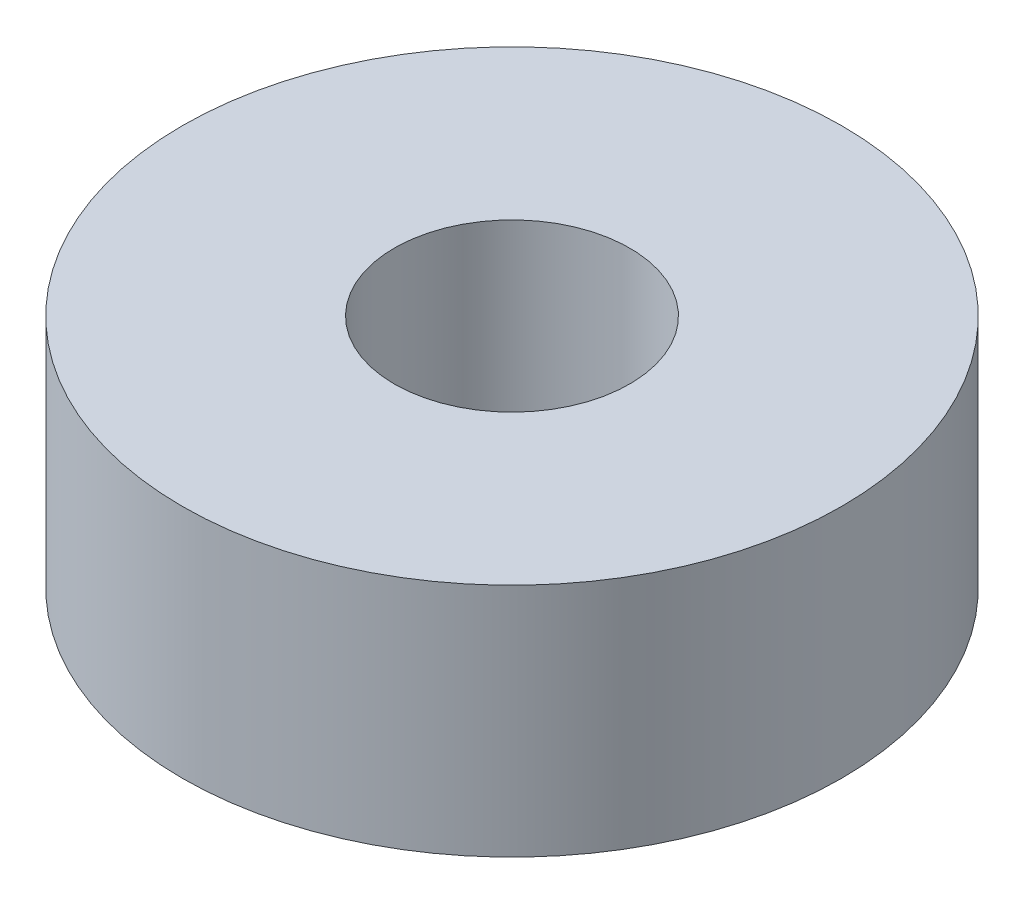
ISO-10303-21;
HEADER;
FILE_DESCRIPTION(('STEP AP214'),'2;1');
FILE_NAME('part.step','',(''),(''),'','','');
FILE_SCHEMA(('AUTOMOTIVE_DESIGN { 1 0 10303 214 1 1 1 1 }'));
ENDSEC;
DATA;
#1=APPLICATION_CONTEXT('core data for automotive mechanical design processes');
#2=APPLICATION_PROTOCOL_DEFINITION('international standard','automotive_design',2000,#1);
#3=PRODUCT_CONTEXT('',#1,'mechanical');
#4=PRODUCT('Part','Part','',(#3));
#5=PRODUCT_RELATED_PRODUCT_CATEGORY('part','',(#4));
#6=PRODUCT_DEFINITION_FORMATION('','',#4);
#7=PRODUCT_DEFINITION_CONTEXT('part definition',#1,'design');
#8=PRODUCT_DEFINITION('design','',#6,#7);
#9=PRODUCT_DEFINITION_SHAPE('','',#8);
#10=(LENGTH_UNIT() NAMED_UNIT(*) SI_UNIT(.MILLI.,.METRE.));
#11=(NAMED_UNIT(*) PLANE_ANGLE_UNIT() SI_UNIT($,.RADIAN.));
#12=(NAMED_UNIT(*) SI_UNIT($,.STERADIAN.) SOLID_ANGLE_UNIT());
#13=UNCERTAINTY_MEASURE_WITH_UNIT(LENGTH_MEASURE(1.E-05),#10,'distance_accuracy_value','');
#14=(GEOMETRIC_REPRESENTATION_CONTEXT(3) GLOBAL_UNCERTAINTY_ASSIGNED_CONTEXT((#13)) GLOBAL_UNIT_ASSIGNED_CONTEXT((#10,
#11,#12)) REPRESENTATION_CONTEXT('',''));
#15=CARTESIAN_POINT('',(0.,0.,0.));
#16=DIRECTION('',(0.,0.,1.));
#17=DIRECTION('',(1.,0.,0.));
#18=AXIS2_PLACEMENT_3D('',#15,#16,#17);
#19=CARTESIAN_POINT('',(0.,2.5,0.));
#20=DIRECTION('',(0.,-1.,0.));
#21=DIRECTION('',(0.,0.,-1.));
#22=AXIS2_PLACEMENT_3D('',#19,#20,#21);
#23=CYLINDRICAL_SURFACE('',#22,7.);
#24=CARTESIAN_POINT('',(0.,2.5,0.));
#25=DIRECTION('',(0.,1.,0.));
#26=DIRECTION('',(0.,0.,1.));
#27=AXIS2_PLACEMENT_3D('',#24,#25,#26);
#28=CIRCLE('',#27,7.);
#29=CARTESIAN_POINT('',(0.,2.5,7.));
#30=VERTEX_POINT('',#29);
#31=EDGE_CURVE('E10',#30,#30,#28,.T.);
#32=ORIENTED_EDGE('',*,*,#31,.F.);
#33=EDGE_LOOP('',(#32));
#34=FACE_BOUND('',#33,.T.);
#35=CARTESIAN_POINT('',(0.,-2.5,0.));
#36=DIRECTION('',(0.,1.,0.));
#37=DIRECTION('',(0.,0.,1.));
#38=AXIS2_PLACEMENT_3D('',#35,#36,#37);
#39=CIRCLE('',#38,7.);
#40=CARTESIAN_POINT('',(0.,-2.5,7.));
#41=VERTEX_POINT('',#40);
#42=EDGE_CURVE('E44',#41,#41,#39,.T.);
#43=ORIENTED_EDGE('',*,*,#42,.T.);
#44=EDGE_LOOP('',(#43));
#45=FACE_BOUND('',#44,.T.);
#46=ADVANCED_FACE('F41',(#34,#45),#23,.T.);
#47=CARTESIAN_POINT('',(0.,2.5,0.));
#48=DIRECTION('',(0.,1.,0.));
#49=DIRECTION('',(0.,0.,1.));
#50=AXIS2_PLACEMENT_3D('',#47,#48,#49);
#51=PLANE('',#50);
#52=CARTESIAN_POINT('',(0.,2.5,0.));
#53=DIRECTION('',(0.,1.,0.));
#54=DIRECTION('',(0.,0.,1.));
#55=AXIS2_PLACEMENT_3D('',#52,#53,#54);
#56=CIRCLE('',#55,2.5);
#57=CARTESIAN_POINT('',(0.,2.5,2.5));
#58=VERTEX_POINT('',#57);
#59=EDGE_CURVE('E58',#58,#58,#56,.T.);
#60=ORIENTED_EDGE('',*,*,#59,.F.);
#61=EDGE_LOOP('',(#60));
#62=FACE_BOUND('',#61,.T.);
#63=ORIENTED_EDGE('',*,*,#31,.T.);
#64=EDGE_LOOP('',(#63));
#65=FACE_BOUND('',#64,.T.);
#66=ADVANCED_FACE('F66',(#62,#65),#51,.T.);
#67=CARTESIAN_POINT('',(0.,-2.5,0.));
#68=DIRECTION('',(0.,1.,0.));
#69=DIRECTION('',(0.,0.,1.));
#70=AXIS2_PLACEMENT_3D('',#67,#68,#69);
#71=PLANE('',#70);
#72=CARTESIAN_POINT('',(0.,-2.5,0.));
#73=DIRECTION('',(0.,1.,0.));
#74=DIRECTION('',(0.,0.,1.));
#75=AXIS2_PLACEMENT_3D('',#72,#73,#74);
#76=CIRCLE('',#75,2.5);
#77=CARTESIAN_POINT('',(0.,-2.5,2.5));
#78=VERTEX_POINT('',#77);
#79=EDGE_CURVE('E53',#78,#78,#76,.F.);
#80=ORIENTED_EDGE('',*,*,#79,.F.);
#81=EDGE_LOOP('',(#80));
#82=FACE_BOUND('',#81,.T.);
#83=ORIENTED_EDGE('',*,*,#42,.F.);
#84=EDGE_LOOP('',(#83));
#85=FACE_BOUND('',#84,.T.);
#86=ADVANCED_FACE('F68',(#82,#85),#71,.F.);
#87=CARTESIAN_POINT('',(0.,-2.501,0.));
#88=DIRECTION('',(0.,1.,0.));
#89=DIRECTION('',(0.,0.,1.));
#90=AXIS2_PLACEMENT_3D('',#87,#88,#89);
#91=CYLINDRICAL_SURFACE('',#90,2.5);
#92=ORIENTED_EDGE('',*,*,#59,.T.);
#93=EDGE_LOOP('',(#92));
#94=FACE_BOUND('',#93,.T.);
#95=ORIENTED_EDGE('',*,*,#79,.T.);
#96=EDGE_LOOP('',(#95));
#97=FACE_BOUND('',#96,.T.);
#98=ADVANCED_FACE('F63',(#94,#97),#91,.F.);
#99=CLOSED_SHELL('',(#46,#66,#86,#98));
#100=MANIFOLD_SOLID_BREP('B2',#99);
#101=ADVANCED_BREP_SHAPE_REPRESENTATION('',(#18,#100),#14);
#102=SHAPE_DEFINITION_REPRESENTATION(#9,#101);
ENDSEC;
END-ISO-10303-21;
